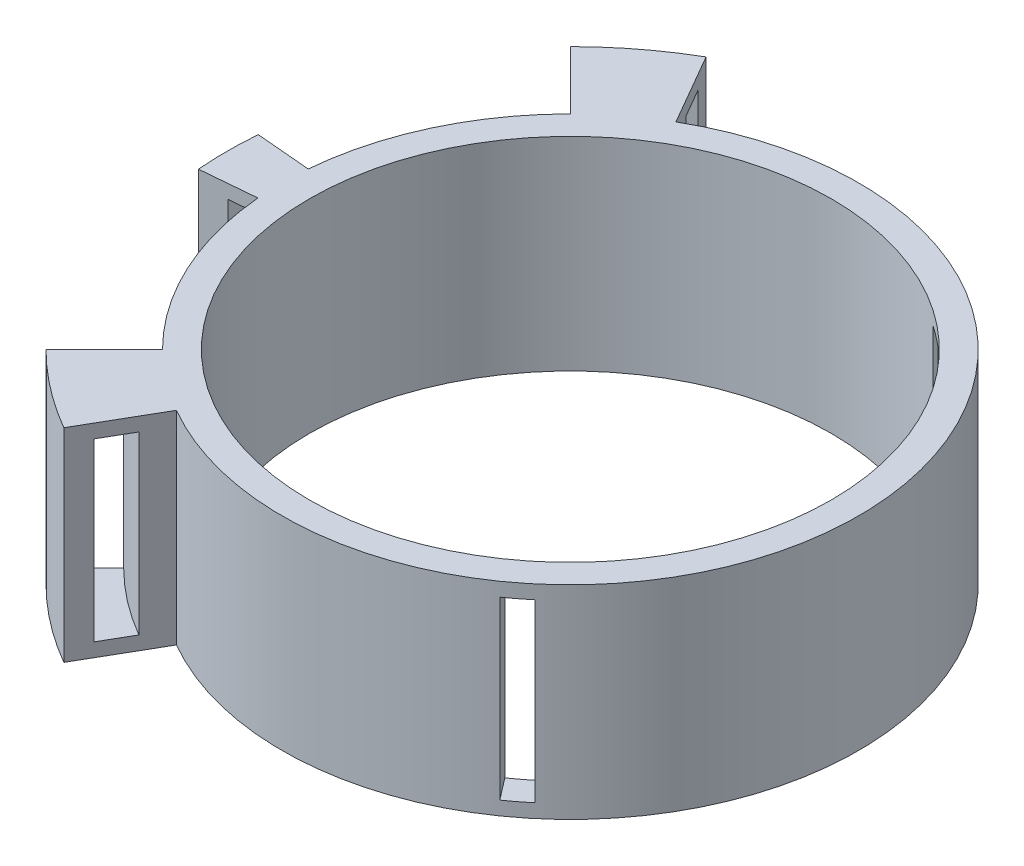
ISO-10303-21;
HEADER;
FILE_DESCRIPTION(('STEP AP214'),'2;1');
FILE_NAME('part.step','',(''),(''),'','','');
FILE_SCHEMA(('AUTOMOTIVE_DESIGN { 1 0 10303 214 1 1 1 1 }'));
ENDSEC;
DATA;
#1=APPLICATION_CONTEXT('core data for automotive mechanical design processes');
#2=APPLICATION_PROTOCOL_DEFINITION('international standard','automotive_design',2000,#1);
#3=PRODUCT_CONTEXT('',#1,'mechanical');
#4=PRODUCT('Part','Part','',(#3));
#5=PRODUCT_RELATED_PRODUCT_CATEGORY('part','',(#4));
#6=PRODUCT_DEFINITION_FORMATION('','',#4);
#7=PRODUCT_DEFINITION_CONTEXT('part definition',#1,'design');
#8=PRODUCT_DEFINITION('design','',#6,#7);
#9=PRODUCT_DEFINITION_SHAPE('','',#8);
#10=(LENGTH_UNIT() NAMED_UNIT(*) SI_UNIT(.MILLI.,.METRE.));
#11=(NAMED_UNIT(*) PLANE_ANGLE_UNIT() SI_UNIT($,.RADIAN.));
#12=(NAMED_UNIT(*) SI_UNIT($,.STERADIAN.) SOLID_ANGLE_UNIT());
#13=UNCERTAINTY_MEASURE_WITH_UNIT(LENGTH_MEASURE(1.E-05),#10,'distance_accuracy_value','');
#14=(GEOMETRIC_REPRESENTATION_CONTEXT(3) GLOBAL_UNCERTAINTY_ASSIGNED_CONTEXT((#13)) GLOBAL_UNIT_ASSIGNED_CONTEXT((#10,
#11,#12)) REPRESENTATION_CONTEXT('',''));
#15=CARTESIAN_POINT('',(0.,0.,0.));
#16=DIRECTION('',(0.,0.,1.));
#17=DIRECTION('',(1.,0.,0.));
#18=AXIS2_PLACEMENT_3D('',#15,#16,#17);
#19=CARTESIAN_POINT('',(0.,0.5,0.));
#20=DIRECTION('',(0.,-1.,0.));
#21=DIRECTION('',(0.,0.,-1.));
#22=AXIS2_PLACEMENT_3D('',#19,#20,#21);
#23=CYLINDRICAL_SURFACE('',#22,10.5);
#24=CARTESIAN_POINT('',(0.,7.4,0.));
#25=DIRECTION('',(0.,1.,0.));
#26=DIRECTION('',(0.,0.,1.));
#27=AXIS2_PLACEMENT_3D('',#24,#25,#26);
#28=CIRCLE('',#27,10.5);
#29=CARTESIAN_POINT('',(-7.42462120245867,7.4,-7.42462120245882));
#30=VERTEX_POINT('',#29);
#31=CARTESIAN_POINT('',(-10.4600443299633,7.4,-0.915135298850366));
#32=VERTEX_POINT('',#31);
#33=EDGE_CURVE('E599',#30,#32,#28,.T.);
#34=ORIENTED_EDGE('',*,*,#33,.F.);
#35=DIRECTION('',(0.,-1.,0.));
#36=VECTOR('',#35,1.);
#37=CARTESIAN_POINT('',(-7.42462120245875,0.5,-7.42462120245875));
#38=LINE('',#37,#36);
#39=CARTESIAN_POINT('',(-7.42462120245875,0.,-7.42462120245875));
#40=VERTEX_POINT('',#39);
#41=EDGE_CURVE('E56',#30,#40,#38,.T.);
#42=ORIENTED_EDGE('',*,*,#41,.T.);
#43=CARTESIAN_POINT('',(0.,0.,0.));
#44=DIRECTION('',(0.,1.,0.));
#45=DIRECTION('',(0.,0.,1.));
#46=AXIS2_PLACEMENT_3D('',#43,#44,#45);
#47=CIRCLE('',#46,10.5);
#48=CARTESIAN_POINT('',(-10.4600443299633,0.,-0.915135298850365));
#49=VERTEX_POINT('',#48);
#50=EDGE_CURVE('E488',#40,#49,#47,.T.);
#51=ORIENTED_EDGE('',*,*,#50,.T.);
#52=DIRECTION('',(0.,-1.,0.));
#53=VECTOR('',#52,1.);
#54=CARTESIAN_POINT('',(-10.4600443299633,0.5,-0.915135298850365));
#55=LINE('',#54,#53);
#56=CARTESIAN_POINT('',(-10.4600443299633,0.5,-0.915135298850365));
#57=VERTEX_POINT('',#56);
#58=EDGE_CURVE('E467',#57,#49,#55,.T.);
#59=ORIENTED_EDGE('',*,*,#58,.F.);
#60=CARTESIAN_POINT('',(0.,0.5,0.));
#61=DIRECTION('',(0.,1.,0.));
#62=DIRECTION('',(0.,0.,1.));
#63=AXIS2_PLACEMENT_3D('',#60,#61,#62);
#64=CIRCLE('',#63,10.5);
#65=CARTESIAN_POINT('',(-10.4600443299633,0.5,0.915135298850311));
#66=VERTEX_POINT('',#65);
#67=EDGE_CURVE('E570',#57,#66,#64,.T.);
#68=ORIENTED_EDGE('',*,*,#67,.T.);
#69=DIRECTION('',(0.,-1.,0.));
#70=VECTOR('',#69,1.);
#71=CARTESIAN_POINT('',(-10.4600443299633,0.5,0.915135298850311));
#72=LINE('',#71,#70);
#73=CARTESIAN_POINT('',(-10.4600443299633,0.,0.915135298850311));
#74=VERTEX_POINT('',#73);
#75=EDGE_CURVE('E473',#66,#74,#72,.T.);
#76=ORIENTED_EDGE('',*,*,#75,.T.);
#77=CARTESIAN_POINT('',(0.,0.,0.));
#78=DIRECTION('',(0.,1.,0.));
#79=DIRECTION('',(0.,0.,1.));
#80=AXIS2_PLACEMENT_3D('',#77,#78,#79);
#81=CIRCLE('',#80,10.5);
#82=CARTESIAN_POINT('',(-7.42462120245875,0.,7.42462120245875));
#83=VERTEX_POINT('',#82);
#84=EDGE_CURVE('E497',#74,#83,#81,.T.);
#85=ORIENTED_EDGE('',*,*,#84,.T.);
#86=DIRECTION('',(0.,-1.,0.));
#87=VECTOR('',#86,1.);
#88=CARTESIAN_POINT('',(-7.42462120245875,0.5,7.42462120245875));
#89=LINE('',#88,#87);
#90=CARTESIAN_POINT('',(-7.42462120245875,7.4,7.42462120245875));
#91=VERTEX_POINT('',#90);
#92=EDGE_CURVE('E505',#91,#83,#89,.T.);
#93=ORIENTED_EDGE('',*,*,#92,.F.);
#94=CARTESIAN_POINT('',(-10.4600443299633,7.4,0.915135298850298));
#95=VERTEX_POINT('',#94);
#96=EDGE_CURVE('E587',#95,#91,#28,.T.);
#97=ORIENTED_EDGE('',*,*,#96,.F.);
#98=DIRECTION('',(0.,-1.,0.));
#99=VECTOR('',#98,1.);
#100=CARTESIAN_POINT('',(-10.4600443299633,7.4,0.915135298850298));
#101=LINE('',#100,#99);
#102=CARTESIAN_POINT('',(-10.4600443299633,6.9,0.915135298850298));
#103=VERTEX_POINT('',#102);
#104=EDGE_CURVE('E323',#95,#103,#101,.T.);
#105=ORIENTED_EDGE('',*,*,#104,.T.);
#106=CARTESIAN_POINT('',(4.64656494415371E-13,6.9,0.));
#107=DIRECTION('',(0.,-1.,0.));
#108=DIRECTION('',(0.,0.,1.));
#109=AXIS2_PLACEMENT_3D('',#106,#107,#108);
#110=CIRCLE('',#109,10.5000000000005);
#111=CARTESIAN_POINT('',(-10.4600443299633,6.9,-0.915135298850366));
#112=VERTEX_POINT('',#111);
#113=EDGE_CURVE('E316',#103,#112,#110,.T.);
#114=ORIENTED_EDGE('',*,*,#113,.T.);
#115=DIRECTION('',(0.,-1.,0.));
#116=VECTOR('',#115,1.);
#117=CARTESIAN_POINT('',(-10.4600443299633,7.4,-0.915135298850366));
#118=LINE('',#117,#116);
#119=EDGE_CURVE('E321',#32,#112,#118,.T.);
#120=ORIENTED_EDGE('',*,*,#119,.F.);
#121=EDGE_LOOP('',(#34,#42,#51,#59,#68,#76,#85,#93,#97,#105,#114,#120));
#122=FACE_BOUND('',#121,.T.);
#123=ADVANCED_FACE('F37',(#122),#23,.T.);
#124=CARTESIAN_POINT('',(0.,6.9,0.));
#125=DIRECTION('',(0.,1.,0.));
#126=DIRECTION('',(0.,0.,1.));
#127=AXIS2_PLACEMENT_3D('',#124,#125,#126);
#128=CIRCLE('',#127,10.5);
#129=CARTESIAN_POINT('',(6.70920905738255,6.9,-8.0769123942467));
#130=VERTEX_POINT('',#129);
#131=CARTESIAN_POINT('',(5.98381017080679,6.9,-8.62809456599481));
#132=VERTEX_POINT('',#131);
#133=EDGE_CURVE('E593',#130,#132,#128,.T.);
#134=ORIENTED_EDGE('',*,*,#133,.T.);
#135=DIRECTION('',(0.,-1.,0.));
#136=VECTOR('',#135,1.);
#137=CARTESIAN_POINT('',(5.98381017080679,6.9,-8.62809456599481));
#138=LINE('',#137,#136);
#139=CARTESIAN_POINT('',(5.98381017080679,0.5,-8.62809456599481));
#140=VERTEX_POINT('',#139);
#141=EDGE_CURVE('E559',#132,#140,#138,.T.);
#142=ORIENTED_EDGE('',*,*,#141,.T.);
#143=CARTESIAN_POINT('',(0.,0.5,0.));
#144=DIRECTION('',(0.,1.,0.));
#145=DIRECTION('',(0.,0.,1.));
#146=AXIS2_PLACEMENT_3D('',#143,#144,#145);
#147=CIRCLE('',#146,10.5);
#148=CARTESIAN_POINT('',(6.70920905738255,0.5,-8.0769123942467));
#149=VERTEX_POINT('',#148);
#150=EDGE_CURVE('E532',#149,#140,#147,.T.);
#151=ORIENTED_EDGE('',*,*,#150,.F.);
#152=DIRECTION('',(0.,-1.,0.));
#153=VECTOR('',#152,1.);
#154=CARTESIAN_POINT('',(6.70920905738255,6.9,-8.0769123942467));
#155=LINE('',#154,#153);
#156=EDGE_CURVE('E573',#130,#149,#155,.T.);
#157=ORIENTED_EDGE('',*,*,#156,.F.);
#158=EDGE_LOOP('',(#134,#142,#151,#157));
#159=FACE_BOUND('',#158,.T.);
#160=DIRECTION('',(0.,-1.,0.));
#161=VECTOR('',#160,1.);
#162=CARTESIAN_POINT('',(6.02746555630799,6.9,8.59765427122543));
#163=LINE('',#162,#161);
#164=CARTESIAN_POINT('',(6.02746555630799,6.9,8.59765427122543));
#165=VERTEX_POINT('',#164);
#166=CARTESIAN_POINT('',(6.02746555630799,0.5,8.59765427122543));
#167=VERTEX_POINT('',#166);
#168=EDGE_CURVE('E548',#165,#167,#163,.T.);
#169=ORIENTED_EDGE('',*,*,#168,.F.);
#170=CARTESIAN_POINT('',(6.74926990170864,6.9,8.04346665274928));
#171=VERTEX_POINT('',#170);
#172=EDGE_CURVE('E590',#165,#171,#128,.T.);
#173=ORIENTED_EDGE('',*,*,#172,.T.);
#174=DIRECTION('',(0.,-1.,0.));
#175=VECTOR('',#174,1.);
#176=CARTESIAN_POINT('',(6.74926990170864,6.9,8.04346665274928));
#177=LINE('',#176,#175);
#178=CARTESIAN_POINT('',(6.74926990170864,0.5,8.04346665274928));
#179=VERTEX_POINT('',#178);
#180=EDGE_CURVE('E522',#171,#179,#177,.T.);
#181=ORIENTED_EDGE('',*,*,#180,.T.);
#182=CARTESIAN_POINT('',(0.,0.5,0.));
#183=DIRECTION('',(0.,1.,0.));
#184=DIRECTION('',(0.,0.,1.));
#185=AXIS2_PLACEMENT_3D('',#182,#183,#184);
#186=CIRCLE('',#185,10.5);
#187=EDGE_CURVE('E537',#167,#179,#186,.T.);
#188=ORIENTED_EDGE('',*,*,#187,.F.);
#189=EDGE_LOOP('',(#169,#173,#181,#188));
#190=FACE_BOUND('',#189,.T.);
#191=DIRECTION('',(0.,-1.,0.));
#192=VECTOR('',#191,1.);
#193=CARTESIAN_POINT('',(-5.25,0.5,-9.09326673973661));
#194=LINE('',#193,#192);
#195=CARTESIAN_POINT('',(-5.25000000000001,7.4,-9.0932667397366));
#196=VERTEX_POINT('',#195);
#197=CARTESIAN_POINT('',(-5.25,0.,-9.09326673973661));
#198=VERTEX_POINT('',#197);
#199=EDGE_CURVE('E64',#196,#198,#194,.T.);
#200=ORIENTED_EDGE('',*,*,#199,.F.);
#201=CARTESIAN_POINT('',(-5.25,7.4,9.0932667397366));
#202=VERTEX_POINT('',#201);
#203=EDGE_CURVE('E459',#202,#196,#28,.T.);
#204=ORIENTED_EDGE('',*,*,#203,.F.);
#205=DIRECTION('',(0.,-1.,0.));
#206=VECTOR('',#205,1.);
#207=CARTESIAN_POINT('',(-5.25,0.5,9.09326673973661));
#208=LINE('',#207,#206);
#209=CARTESIAN_POINT('',(-5.25,0.,9.09326673973661));
#210=VERTEX_POINT('',#209);
#211=EDGE_CURVE('E48',#202,#210,#208,.T.);
#212=ORIENTED_EDGE('',*,*,#211,.T.);
#213=CARTESIAN_POINT('',(0.,0.,0.));
#214=DIRECTION('',(0.,1.,0.));
#215=DIRECTION('',(0.,0.,1.));
#216=AXIS2_PLACEMENT_3D('',#213,#214,#215);
#217=CIRCLE('',#216,10.5);
#218=EDGE_CURVE('E458',#210,#198,#217,.T.);
#219=ORIENTED_EDGE('',*,*,#218,.T.);
#220=EDGE_LOOP('',(#200,#204,#212,#219));
#221=FACE_BOUND('',#220,.T.);
#222=ADVANCED_FACE('F412',(#159,#190,#221),#23,.T.);
#223=CARTESIAN_POINT('',(0.,0.5,0.));
#224=DIRECTION('',(0.,1.,0.));
#225=DIRECTION('',(0.,0.,1.));
#226=AXIS2_PLACEMENT_3D('',#223,#224,#225);
#227=PLANE('',#226);
#228=DIRECTION('',(0.707106781186547,0.,0.707106781186547));
#229=VECTOR('',#228,1.);
#230=CARTESIAN_POINT('',(-7.42462120245875,0.5,-7.42462120245875));
#231=LINE('',#230,#229);
#232=CARTESIAN_POINT('',(-8.98025612106915,0.5,-8.98025612106916));
#233=VERTEX_POINT('',#232);
#234=CARTESIAN_POINT('',(-8.13172798364529,0.5,-8.13172798364529));
#235=VERTEX_POINT('',#234);
#236=EDGE_CURVE('E528',#233,#235,#231,.T.);
#237=ORIENTED_EDGE('',*,*,#236,.T.);
#238=CARTESIAN_POINT('',(5.79397640976254E-13,0.5,6.50521303491303E-13));
#239=DIRECTION('',(0.,1.,0.));
#240=DIRECTION('',(0.,0.,-1.));
#241=AXIS2_PLACEMENT_3D('',#238,#239,#240);
#242=CIRCLE('',#241,11.5000000000009);
#243=CARTESIAN_POINT('',(-5.75,0.5,-9.95929214352105));
#244=VERTEX_POINT('',#243);
#245=EDGE_CURVE('E656',#244,#235,#242,.T.);
#246=ORIENTED_EDGE('',*,*,#245,.F.);
#247=DIRECTION('',(-0.5,0.,-0.866025403784439));
#248=VECTOR('',#247,1.);
#249=CARTESIAN_POINT('',(-5.25,0.5,-9.09326673973661));
#250=LINE('',#249,#248);
#251=CARTESIAN_POINT('',(-6.35,0.5,-10.9985226280624));
#252=VERTEX_POINT('',#251);
#253=EDGE_CURVE('E530',#244,#252,#250,.T.);
#254=ORIENTED_EDGE('',*,*,#253,.T.);
#255=CARTESIAN_POINT('',(-1.28369537222284E-13,0.5,-1.94289029309402E-13));
#256=DIRECTION('',(0.,-1.,0.));
#257=DIRECTION('',(0.,0.,-1.));
#258=AXIS2_PLACEMENT_3D('',#255,#256,#257);
#259=CIRCLE('',#258,12.6999999999998);
#260=EDGE_CURVE('E644',#233,#252,#259,.T.);
#261=ORIENTED_EDGE('',*,*,#260,.F.);
#262=EDGE_LOOP('',(#237,#246,#254,#261));
#263=FACE_BOUND('',#262,.T.);
#264=ADVANCED_FACE('F400',(#263),#227,.T.);
#265=DIRECTION('',(-0.996194698091746,0.,-0.0871557427476535));
#266=VECTOR('',#265,1.);
#267=CARTESIAN_POINT('',(-10.4600443299633,0.5,-0.915135298850362));
#268=LINE('',#267,#266);
#269=CARTESIAN_POINT('',(-11.4562390280551,0.5,-1.00229104159802));
#270=VERTEX_POINT('',#269);
#271=EDGE_CURVE('E526',#57,#270,#268,.T.);
#272=ORIENTED_EDGE('',*,*,#271,.T.);
#273=CARTESIAN_POINT('',(2.61943244872498E-13,0.5,0.));
#274=DIRECTION('',(0.,-1.,0.));
#275=DIRECTION('',(0.,0.,1.));
#276=AXIS2_PLACEMENT_3D('',#273,#274,#275);
#277=CIRCLE('',#276,11.5000000000003);
#278=CARTESIAN_POINT('',(-11.4562390280551,0.5,1.00229104159796));
#279=VERTEX_POINT('',#278);
#280=EDGE_CURVE('E632',#279,#270,#277,.T.);
#281=ORIENTED_EDGE('',*,*,#280,.F.);
#282=DIRECTION('',(0.996194698091746,0.,-0.0871557427476487));
#283=VECTOR('',#282,1.);
#284=CARTESIAN_POINT('',(-10.4600443299633,0.5,0.915135298850311));
#285=LINE('',#284,#283);
#286=EDGE_CURVE('E524',#279,#66,#285,.T.);
#287=ORIENTED_EDGE('',*,*,#286,.T.);
#288=ORIENTED_EDGE('',*,*,#67,.F.);
#289=EDGE_LOOP('',(#272,#281,#287,#288));
#290=FACE_BOUND('',#289,.T.);
#291=ADVANCED_FACE('F398',(#290),#227,.T.);
#292=DIRECTION('',(0.5,0.,-0.866025403784439));
#293=VECTOR('',#292,1.);
#294=CARTESIAN_POINT('',(-5.25,0.5,9.09326673973661));
#295=LINE('',#294,#293);
#296=CARTESIAN_POINT('',(-6.35000000000001,0.5,10.9985226280624));
#297=VERTEX_POINT('',#296);
#298=CARTESIAN_POINT('',(-5.75,0.5,9.95929214352105));
#299=VERTEX_POINT('',#298);
#300=EDGE_CURVE('E501',#297,#299,#295,.T.);
#301=ORIENTED_EDGE('',*,*,#300,.T.);
#302=CARTESIAN_POINT('',(0.,0.5,0.));
#303=DIRECTION('',(0.,1.,0.));
#304=DIRECTION('',(0.,0.,1.));
#305=AXIS2_PLACEMENT_3D('',#302,#303,#304);
#306=CIRCLE('',#305,11.5000000000001);
#307=CARTESIAN_POINT('',(-8.13172798364529,0.5,8.13172798364529));
#308=VERTEX_POINT('',#307);
#309=EDGE_CURVE('E620',#308,#299,#306,.T.);
#310=ORIENTED_EDGE('',*,*,#309,.F.);
#311=DIRECTION('',(-0.707106781186548,0.,0.707106781186548));
#312=VECTOR('',#311,1.);
#313=CARTESIAN_POINT('',(-7.42462120245875,0.5,7.42462120245875));
#314=LINE('',#313,#312);
#315=CARTESIAN_POINT('',(-8.98025612106915,0.5,8.98025612106915));
#316=VERTEX_POINT('',#315);
#317=EDGE_CURVE('E506',#308,#316,#314,.T.);
#318=ORIENTED_EDGE('',*,*,#317,.T.);
#319=CARTESIAN_POINT('',(2.23779328401008E-13,0.5,-2.53269627492614E-13));
#320=DIRECTION('',(0.,-1.,0.));
#321=DIRECTION('',(0.,0.,1.));
#322=AXIS2_PLACEMENT_3D('',#319,#320,#321);
#323=CIRCLE('',#322,12.7000000000003);
#324=EDGE_CURVE('E608',#297,#316,#323,.T.);
#325=ORIENTED_EDGE('',*,*,#324,.F.);
#326=EDGE_LOOP('',(#301,#310,#318,#325));
#327=FACE_BOUND('',#326,.T.);
#328=ADVANCED_FACE('F394',(#327),#227,.T.);
#329=CARTESIAN_POINT('',(0.,0.5,0.));
#330=DIRECTION('',(0.,-1.,0.));
#331=DIRECTION('',(0.,0.,1.));
#332=AXIS2_PLACEMENT_3D('',#329,#330,#331);
#333=CIRCLE('',#332,9.5);
#334=CARTESIAN_POINT('',(5.37818083124572,0.5,-7.83103894425389));
#335=VERTEX_POINT('',#334);
#336=CARTESIAN_POINT('',(6.07023676620326,0.5,-7.30768264241368));
#337=VERTEX_POINT('',#336);
#338=EDGE_CURVE('E536',#335,#337,#333,.T.);
#339=ORIENTED_EDGE('',*,*,#338,.T.);
#340=DIRECTION('',(-0.638972291179291,0.,0.769229751833019));
#341=VECTOR('',#340,1.);
#342=CARTESIAN_POINT('',(0.,0.5,0.));
#343=LINE('',#342,#341);
#344=EDGE_CURVE('E584',#149,#337,#343,.T.);
#345=ORIENTED_EDGE('',*,*,#344,.F.);
#346=ORIENTED_EDGE('',*,*,#150,.T.);
#347=DIRECTION('',(0.604999089059933,0.,-0.796226162743131));
#348=VECTOR('',#347,1.);
#349=CARTESIAN_POINT('',(-0.362699443287879,0.5,-0.275591085874055));
#350=LINE('',#349,#348);
#351=EDGE_CURVE('E563',#335,#140,#350,.T.);
#352=ORIENTED_EDGE('',*,*,#351,.F.);
#353=EDGE_LOOP('',(#339,#345,#346,#352));
#354=FACE_BOUND('',#353,.T.);
#355=ADVANCED_FACE('F397',(#354),#227,.T.);
#356=CARTESIAN_POINT('',(6.10648229202211,0.5,7.2774222096303));
#357=VERTEX_POINT('',#356);
#358=CARTESIAN_POINT('',(5.41784455697416,0.5,7.80365045068431));
#359=VERTEX_POINT('',#358);
#360=EDGE_CURVE('E534',#357,#359,#333,.T.);
#361=ORIENTED_EDGE('',*,*,#360,.T.);
#362=DIRECTION('',(-0.608988032530658,0.,-0.793179409865409));
#363=VECTOR('',#362,1.);
#364=CARTESIAN_POINT('',(-0.360902172700351,0.5,0.27709380923809));
#365=LINE('',#364,#363);
#366=EDGE_CURVE('E567',#167,#359,#365,.T.);
#367=ORIENTED_EDGE('',*,*,#366,.F.);
#368=ORIENTED_EDGE('',*,*,#187,.T.);
#369=DIRECTION('',(-0.642787609686538,0.,-0.766044443118979));
#370=VECTOR('',#369,1.);
#371=CARTESIAN_POINT('',(0.,0.5,0.));
#372=LINE('',#371,#370);
#373=EDGE_CURVE('E545',#179,#357,#372,.T.);
#374=ORIENTED_EDGE('',*,*,#373,.T.);
#375=EDGE_LOOP('',(#361,#367,#368,#374));
#376=FACE_BOUND('',#375,.T.);
#377=ADVANCED_FACE('F401',(#376),#227,.T.);
#378=CARTESIAN_POINT('',(0.,0.5,0.));
#379=DIRECTION('',(0.,-1.,0.));
#380=DIRECTION('',(0.,0.,-1.));
#381=AXIS2_PLACEMENT_3D('',#378,#379,#380);
#382=CYLINDRICAL_SURFACE('',#381,13.5);
#383=CARTESIAN_POINT('',(0.,0.,0.));
#384=DIRECTION('',(0.,1.,0.));
#385=DIRECTION('',(0.,0.,1.));
#386=AXIS2_PLACEMENT_3D('',#383,#384,#385);
#387=CIRCLE('',#386,13.5);
#388=CARTESIAN_POINT('',(-9.54594154601839,0.,9.54594154601839));
#389=VERTEX_POINT('',#388);
#390=CARTESIAN_POINT('',(-6.75,0.,11.6913429510899));
#391=VERTEX_POINT('',#390);
#392=EDGE_CURVE('E456',#389,#391,#387,.T.);
#393=ORIENTED_EDGE('',*,*,#392,.T.);
#394=DIRECTION('',(0.,-1.,0.));
#395=VECTOR('',#394,1.);
#396=CARTESIAN_POINT('',(-6.75,0.5,11.6913429510899));
#397=LINE('',#396,#395);
#398=CARTESIAN_POINT('',(-6.75,7.4,11.6913429510899));
#399=VERTEX_POINT('',#398);
#400=EDGE_CURVE('E11',#399,#391,#397,.T.);
#401=ORIENTED_EDGE('',*,*,#400,.F.);
#402=CARTESIAN_POINT('',(-2.32452945780892E-13,7.4,-4.16333634234434E-13));
#403=DIRECTION('',(0.,1.,0.));
#404=DIRECTION('',(0.,0.,1.));
#405=AXIS2_PLACEMENT_3D('',#402,#403,#404);
#406=CIRCLE('',#405,13.5000000000002);
#407=CARTESIAN_POINT('',(-9.54594154601839,7.4,9.54594154601839));
#408=VERTEX_POINT('',#407);
#409=EDGE_CURVE('E289',#408,#399,#406,.T.);
#410=ORIENTED_EDGE('',*,*,#409,.F.);
#411=DIRECTION('',(0.,-1.,0.));
#412=VECTOR('',#411,1.);
#413=CARTESIAN_POINT('',(-9.54594154601839,0.5,9.54594154601839));
#414=LINE('',#413,#412);
#415=EDGE_CURVE('E502',#408,#389,#414,.T.);
#416=ORIENTED_EDGE('',*,*,#415,.T.);
#417=EDGE_LOOP('',(#393,#401,#410,#416));
#418=FACE_BOUND('',#417,.T.);
#419=ADVANCED_FACE('F39',(#418),#382,.T.);
#420=CARTESIAN_POINT('',(-5.25,0.5,9.09326673973661));
#421=DIRECTION('',(-0.866025403784439,0.,-0.5));
#422=DIRECTION('',(-0.5,0.,0.866025403784439));
#423=AXIS2_PLACEMENT_3D('',#420,#421,#422);
#424=PLANE('',#423);
#425=DIRECTION('',(0.,-1.,0.));
#426=VECTOR('',#425,1.);
#427=CARTESIAN_POINT('',(-6.35000000000001,6.9,10.9985226280624));
#428=LINE('',#427,#426);
#429=CARTESIAN_POINT('',(-6.35000000000001,6.9,10.9985226280624));
#430=VERTEX_POINT('',#429);
#431=EDGE_CURVE('E447',#430,#297,#428,.T.);
#432=ORIENTED_EDGE('',*,*,#431,.F.);
#433=DIRECTION('',(0.5,0.,-0.866025403784439));
#434=VECTOR('',#433,1.);
#435=CARTESIAN_POINT('',(-6.75,6.9,11.6913429510899));
#436=LINE('',#435,#434);
#437=CARTESIAN_POINT('',(-5.75,6.9,9.95929214352105));
#438=VERTEX_POINT('',#437);
#439=EDGE_CURVE('E286',#430,#438,#436,.T.);
#440=ORIENTED_EDGE('',*,*,#439,.T.);
#441=DIRECTION('',(0.,-1.,0.));
#442=VECTOR('',#441,1.);
#443=CARTESIAN_POINT('',(-5.75,6.9,9.95929214352105));
#444=LINE('',#443,#442);
#445=EDGE_CURVE('E616',#438,#299,#444,.T.);
#446=ORIENTED_EDGE('',*,*,#445,.T.);
#447=ORIENTED_EDGE('',*,*,#300,.F.);
#448=EDGE_LOOP('',(#432,#440,#446,#447));
#449=FACE_BOUND('',#448,.T.);
#450=DIRECTION('',(0.5,0.,-0.866025403784439));
#451=VECTOR('',#450,1.);
#452=CARTESIAN_POINT('',(-5.25,0.,9.09326673973661));
#453=LINE('',#452,#451);
#454=EDGE_CURVE('E450',#391,#210,#453,.T.);
#455=ORIENTED_EDGE('',*,*,#454,.T.);
#456=ORIENTED_EDGE('',*,*,#211,.F.);
#457=DIRECTION('',(0.5,0.,-0.866025403784439));
#458=VECTOR('',#457,1.);
#459=CARTESIAN_POINT('',(-6.75,7.4,11.6913429510899));
#460=LINE('',#459,#458);
#461=EDGE_CURVE('E292',#399,#202,#460,.T.);
#462=ORIENTED_EDGE('',*,*,#461,.F.);
#463=ORIENTED_EDGE('',*,*,#400,.T.);
#464=EDGE_LOOP('',(#455,#456,#462,#463));
#465=FACE_BOUND('',#464,.T.);
#466=ADVANCED_FACE('F436',(#449,#465),#424,.F.);
#467=CARTESIAN_POINT('',(0.,0.5,0.));
#468=DIRECTION('',(0.,-1.,0.));
#469=DIRECTION('',(0.,0.,-1.));
#470=AXIS2_PLACEMENT_3D('',#467,#468,#469);
#471=CYLINDRICAL_SURFACE('',#470,9.5);
#472=CARTESIAN_POINT('',(0.,0.,0.));
#473=DIRECTION('',(0.,-1.,0.));
#474=DIRECTION('',(0.,0.,1.));
#475=AXIS2_PLACEMENT_3D('',#472,#473,#474);
#476=CIRCLE('',#475,9.5);
#477=CARTESIAN_POINT('',(0.,0.,9.5));
#478=VERTEX_POINT('',#477);
#479=EDGE_CURVE('E455',#478,#478,#476,.T.);
#480=ORIENTED_EDGE('',*,*,#479,.T.);
#481=EDGE_LOOP('',(#480));
#482=FACE_BOUND('',#481,.T.);
#483=DIRECTION('',(0.,-1.,0.));
#484=VECTOR('',#483,1.);
#485=CARTESIAN_POINT('',(6.10648229202211,6.9,7.2774222096303));
#486=LINE('',#485,#484);
#487=CARTESIAN_POINT('',(6.10648229202211,6.9,7.2774222096303));
#488=VERTEX_POINT('',#487);
#489=EDGE_CURVE('E542',#488,#357,#486,.T.);
#490=ORIENTED_EDGE('',*,*,#489,.F.);
#491=CARTESIAN_POINT('',(0.,6.9,0.));
#492=DIRECTION('',(0.,-1.,0.));
#493=DIRECTION('',(0.,0.,1.));
#494=AXIS2_PLACEMENT_3D('',#491,#492,#493);
#495=CIRCLE('',#494,9.5);
#496=CARTESIAN_POINT('',(5.41784455697416,6.9,7.80365045068431));
#497=VERTEX_POINT('',#496);
#498=EDGE_CURVE('E594',#488,#497,#495,.T.);
#499=ORIENTED_EDGE('',*,*,#498,.T.);
#500=DIRECTION('',(0.,-1.,0.));
#501=VECTOR('',#500,1.);
#502=CARTESIAN_POINT('',(5.41784455697416,6.9,7.80365045068431));
#503=LINE('',#502,#501);
#504=EDGE_CURVE('E553',#497,#359,#503,.T.);
#505=ORIENTED_EDGE('',*,*,#504,.T.);
#506=ORIENTED_EDGE('',*,*,#360,.F.);
#507=EDGE_LOOP('',(#490,#499,#505,#506));
#508=FACE_BOUND('',#507,.T.);
#509=DIRECTION('',(0.,-1.,0.));
#510=VECTOR('',#509,1.);
#511=CARTESIAN_POINT('',(5.37818083124572,6.9,-7.83103894425389));
#512=LINE('',#511,#510);
#513=CARTESIAN_POINT('',(5.37818083124572,6.9,-7.83103894425389));
#514=VERTEX_POINT('',#513);
#515=EDGE_CURVE('E556',#514,#335,#512,.T.);
#516=ORIENTED_EDGE('',*,*,#515,.F.);
#517=CARTESIAN_POINT('',(6.07023676620326,6.9,-7.30768264241368));
#518=VERTEX_POINT('',#517);
#519=EDGE_CURVE('E595',#514,#518,#495,.T.);
#520=ORIENTED_EDGE('',*,*,#519,.T.);
#521=DIRECTION('',(0.,-1.,0.));
#522=VECTOR('',#521,1.);
#523=CARTESIAN_POINT('',(6.07023676620326,6.9,-7.30768264241368));
#524=LINE('',#523,#522);
#525=EDGE_CURVE('E580',#518,#337,#524,.T.);
#526=ORIENTED_EDGE('',*,*,#525,.T.);
#527=ORIENTED_EDGE('',*,*,#338,.F.);
#528=EDGE_LOOP('',(#516,#520,#526,#527));
#529=FACE_BOUND('',#528,.T.);
#530=CARTESIAN_POINT('',(0.,7.4,0.));
#531=DIRECTION('',(0.,-1.,0.));
#532=DIRECTION('',(0.,0.,1.));
#533=AXIS2_PLACEMENT_3D('',#530,#531,#532);
#534=CIRCLE('',#533,9.5);
#535=CARTESIAN_POINT('',(0.,7.4,9.5));
#536=VERTEX_POINT('',#535);
#537=EDGE_CURVE('E600',#536,#536,#534,.T.);
#538=ORIENTED_EDGE('',*,*,#537,.F.);
#539=EDGE_LOOP('',(#538));
#540=FACE_BOUND('',#539,.T.);
#541=ADVANCED_FACE('F433',(#482,#508,#529,#540),#471,.F.);
#542=CARTESIAN_POINT('',(-5.25,0.5,-9.09326673973661));
#543=DIRECTION('',(-0.866025403784439,0.,0.5));
#544=DIRECTION('',(0.5,0.,0.866025403784439));
#545=AXIS2_PLACEMENT_3D('',#542,#543,#544);
#546=PLANE('',#545);
#547=DIRECTION('',(0.,-1.,0.));
#548=VECTOR('',#547,1.);
#549=CARTESIAN_POINT('',(-6.75,0.5,-11.6913429510899));
#550=LINE('',#549,#548);
#551=CARTESIAN_POINT('',(-6.75,7.4,-11.6913429510901));
#552=VERTEX_POINT('',#551);
#553=CARTESIAN_POINT('',(-6.75,0.,-11.6913429510899));
#554=VERTEX_POINT('',#553);
#555=EDGE_CURVE('E266',#552,#554,#550,.T.);
#556=ORIENTED_EDGE('',*,*,#555,.F.);
#557=DIRECTION('',(-0.500000000000001,0.,-0.866025403784438));
#558=VECTOR('',#557,1.);
#559=CARTESIAN_POINT('',(-6.75,7.4,-11.6913429510901));
#560=LINE('',#559,#558);
#561=EDGE_CURVE('E272',#196,#552,#560,.T.);
#562=ORIENTED_EDGE('',*,*,#561,.F.);
#563=ORIENTED_EDGE('',*,*,#199,.T.);
#564=DIRECTION('',(-0.5,0.,-0.866025403784439));
#565=VECTOR('',#564,1.);
#566=CARTESIAN_POINT('',(-5.25,0.,-9.09326673973661));
#567=LINE('',#566,#565);
#568=EDGE_CURVE('E514',#198,#554,#567,.T.);
#569=ORIENTED_EDGE('',*,*,#568,.T.);
#570=EDGE_LOOP('',(#556,#562,#563,#569));
#571=FACE_BOUND('',#570,.T.);
#572=DIRECTION('',(-0.500000000000001,0.,-0.866025403784438));
#573=VECTOR('',#572,1.);
#574=CARTESIAN_POINT('',(-6.75,6.9,-11.6913429510901));
#575=LINE('',#574,#573);
#576=CARTESIAN_POINT('',(-5.74999999999995,6.9,-9.9592921435211));
#577=VERTEX_POINT('',#576);
#578=CARTESIAN_POINT('',(-6.35,6.9,-10.9985226280624));
#579=VERTEX_POINT('',#578);
#580=EDGE_CURVE('E279',#577,#579,#575,.T.);
#581=ORIENTED_EDGE('',*,*,#580,.T.);
#582=DIRECTION('',(0.,-1.,0.));
#583=VECTOR('',#582,1.);
#584=CARTESIAN_POINT('',(-6.35,6.9,-10.9985226280624));
#585=LINE('',#584,#583);
#586=EDGE_CURVE('E640',#579,#252,#585,.T.);
#587=ORIENTED_EDGE('',*,*,#586,.T.);
#588=ORIENTED_EDGE('',*,*,#253,.F.);
#589=DIRECTION('',(0.,-1.,0.));
#590=VECTOR('',#589,1.);
#591=CARTESIAN_POINT('',(-5.75000000000001,6.9,-9.95929214352105));
#592=LINE('',#591,#590);
#593=EDGE_CURVE('E647',#577,#244,#592,.T.);
#594=ORIENTED_EDGE('',*,*,#593,.F.);
#595=EDGE_LOOP('',(#581,#587,#588,#594));
#596=FACE_BOUND('',#595,.T.);
#597=ADVANCED_FACE('F430',(#571,#596),#546,.F.);
#598=CARTESIAN_POINT('',(0.,0.5,0.));
#599=DIRECTION('',(0.,-1.,0.));
#600=DIRECTION('',(0.,0.,-1.));
#601=AXIS2_PLACEMENT_3D('',#598,#599,#600);
#602=CYLINDRICAL_SURFACE('',#601,13.5);
#603=CARTESIAN_POINT('',(0.,0.,0.));
#604=DIRECTION('',(0.,1.,0.));
#605=DIRECTION('',(0.,0.,1.));
#606=AXIS2_PLACEMENT_3D('',#603,#604,#605);
#607=CIRCLE('',#606,13.5);
#608=CARTESIAN_POINT('',(-9.54594154601839,0.,-9.5459415460184));
#609=VERTEX_POINT('',#608);
#610=EDGE_CURVE('E264',#554,#609,#607,.T.);
#611=ORIENTED_EDGE('',*,*,#610,.T.);
#612=DIRECTION('',(0.,-1.,0.));
#613=VECTOR('',#612,1.);
#614=CARTESIAN_POINT('',(-9.54594154601839,0.5,-9.5459415460184));
#615=LINE('',#614,#613);
#616=CARTESIAN_POINT('',(-9.54594154601839,7.4,-9.54594154601853));
#617=VERTEX_POINT('',#616);
#618=EDGE_CURVE('E258',#617,#609,#615,.T.);
#619=ORIENTED_EDGE('',*,*,#618,.F.);
#620=CARTESIAN_POINT('',(-1.31838984174237E-13,7.4,-3.48679418671338E-13));
#621=DIRECTION('',(0.,1.,0.));
#622=DIRECTION('',(0.,0.,1.));
#623=AXIS2_PLACEMENT_3D('',#620,#621,#622);
#624=CIRCLE('',#623,13.4999999999998);
#625=EDGE_CURVE('E262',#552,#617,#624,.T.);
#626=ORIENTED_EDGE('',*,*,#625,.F.);
#627=ORIENTED_EDGE('',*,*,#555,.T.);
#628=EDGE_LOOP('',(#611,#619,#626,#627));
#629=FACE_BOUND('',#628,.T.);
#630=ADVANCED_FACE('F259',(#629),#602,.T.);
#631=CARTESIAN_POINT('',(-7.42462120245875,0.5,-7.42462120245875));
#632=DIRECTION('',(0.707106781186547,0.,-0.707106781186547));
#633=DIRECTION('',(-0.707106781186548,0.,-0.707106781186548));
#634=AXIS2_PLACEMENT_3D('',#631,#632,#633);
#635=PLANE('',#634);
#636=DIRECTION('',(0.,-1.,0.));
#637=VECTOR('',#636,1.);
#638=CARTESIAN_POINT('',(-8.98025612106915,6.9,-8.98025612106916));
#639=LINE('',#638,#637);
#640=CARTESIAN_POINT('',(-8.98025612106915,6.9,-8.98025612106916));
#641=VERTEX_POINT('',#640);
#642=EDGE_CURVE('E635',#641,#233,#639,.T.);
#643=ORIENTED_EDGE('',*,*,#642,.F.);
#644=DIRECTION('',(0.707106781186549,0.,0.707106781186546));
#645=VECTOR('',#644,1.);
#646=CARTESIAN_POINT('',(-9.54594154601839,6.9,-9.54594154601853));
#647=LINE('',#646,#645);
#648=CARTESIAN_POINT('',(-8.13172798364529,6.9,-8.1317279836453));
#649=VERTEX_POINT('',#648);
#650=EDGE_CURVE('E282',#641,#649,#647,.T.);
#651=ORIENTED_EDGE('',*,*,#650,.T.);
#652=DIRECTION('',(0.,-1.,0.));
#653=VECTOR('',#652,1.);
#654=CARTESIAN_POINT('',(-8.13172798364529,6.9,-8.1317279836453));
#655=LINE('',#654,#653);
#656=EDGE_CURVE('E652',#649,#235,#655,.T.);
#657=ORIENTED_EDGE('',*,*,#656,.T.);
#658=ORIENTED_EDGE('',*,*,#236,.F.);
#659=EDGE_LOOP('',(#643,#651,#657,#658));
#660=FACE_BOUND('',#659,.T.);
#661=DIRECTION('',(0.707106781186547,0.,0.707106781186547));
#662=VECTOR('',#661,1.);
#663=CARTESIAN_POINT('',(-7.42462120245875,0.,-7.42462120245875));
#664=LINE('',#663,#662);
#665=EDGE_CURVE('E492',#609,#40,#664,.T.);
#666=ORIENTED_EDGE('',*,*,#665,.T.);
#667=ORIENTED_EDGE('',*,*,#41,.F.);
#668=DIRECTION('',(0.707106781186549,0.,0.707106781186546));
#669=VECTOR('',#668,1.);
#670=CARTESIAN_POINT('',(-9.54594154601839,7.4,-9.54594154601853));
#671=LINE('',#670,#669);
#672=EDGE_CURVE('E269',#617,#30,#671,.T.);
#673=ORIENTED_EDGE('',*,*,#672,.F.);
#674=ORIENTED_EDGE('',*,*,#618,.T.);
#675=EDGE_LOOP('',(#666,#667,#673,#674));
#676=FACE_BOUND('',#675,.T.);
#677=ADVANCED_FACE('F270',(#660,#676),#635,.F.);
#678=CARTESIAN_POINT('',(-10.4600443299633,0.5,-0.915135298850362));
#679=DIRECTION('',(-0.0871557427476535,0.,0.996194698091746));
#680=DIRECTION('',(0.996194698091746,0.,0.0871557427476535));
#681=AXIS2_PLACEMENT_3D('',#678,#679,#680);
#682=PLANE('',#681);
#683=DIRECTION('',(-0.996194698091746,0.,-0.0871557427476535));
#684=VECTOR('',#683,1.);
#685=CARTESIAN_POINT('',(-10.4600443299633,0.,-0.915135298850362));
#686=LINE('',#685,#684);
#687=CARTESIAN_POINT('',(-12.4524337261468,0.,-1.08944678434567));
#688=VERTEX_POINT('',#687);
#689=EDGE_CURVE('E483',#49,#688,#686,.T.);
#690=ORIENTED_EDGE('',*,*,#689,.T.);
#691=DIRECTION('',(0.,-1.,0.));
#692=VECTOR('',#691,1.);
#693=CARTESIAN_POINT('',(-12.4524337261468,0.5,-1.08944678434567));
#694=LINE('',#693,#692);
#695=CARTESIAN_POINT('',(-12.4524337261468,6.9,-1.08944678434567));
#696=VERTEX_POINT('',#695);
#697=EDGE_CURVE('E464',#696,#688,#694,.T.);
#698=ORIENTED_EDGE('',*,*,#697,.F.);
#699=DIRECTION('',(0.,-1.,0.));
#700=VECTOR('',#699,1.);
#701=CARTESIAN_POINT('',(-12.4524337261468,7.4,-1.08944678434567));
#702=LINE('',#701,#700);
#703=CARTESIAN_POINT('',(-12.4524337261468,7.4,-1.08944678434567));
#704=VERTEX_POINT('',#703);
#705=EDGE_CURVE('E313',#704,#696,#702,.T.);
#706=ORIENTED_EDGE('',*,*,#705,.F.);
#707=DIRECTION('',(-0.996194698091746,0.,-0.0871557427476516));
#708=VECTOR('',#707,1.);
#709=CARTESIAN_POINT('',(-12.4524337261468,7.4,-1.08944678434567));
#710=LINE('',#709,#708);
#711=EDGE_CURVE('E311',#32,#704,#710,.T.);
#712=ORIENTED_EDGE('',*,*,#711,.F.);
#713=ORIENTED_EDGE('',*,*,#119,.T.);
#714=DIRECTION('',(-0.996194698091746,0.,-0.0871557427476516));
#715=VECTOR('',#714,1.);
#716=CARTESIAN_POINT('',(-12.4524337261468,6.9,-1.08944678434567));
#717=LINE('',#716,#715);
#718=CARTESIAN_POINT('',(-11.4562390280551,6.9,-1.00229104159802));
#719=VERTEX_POINT('',#718);
#720=EDGE_CURVE('E308',#112,#719,#717,.T.);
#721=ORIENTED_EDGE('',*,*,#720,.T.);
#722=DIRECTION('',(0.,-1.,0.));
#723=VECTOR('',#722,1.);
#724=CARTESIAN_POINT('',(-11.4562390280551,6.9,-1.00229104159802));
#725=LINE('',#724,#723);
#726=EDGE_CURVE('E628',#719,#270,#725,.T.);
#727=ORIENTED_EDGE('',*,*,#726,.T.);
#728=ORIENTED_EDGE('',*,*,#271,.F.);
#729=ORIENTED_EDGE('',*,*,#58,.T.);
#730=EDGE_LOOP('',(#690,#698,#706,#712,#713,#721,#727,#728,#729));
#731=FACE_BOUND('',#730,.T.);
#732=ADVANCED_FACE('F420',(#731),#682,.F.);
#733=CARTESIAN_POINT('',(0.,0.5,0.));
#734=DIRECTION('',(0.,-1.,0.));
#735=DIRECTION('',(0.,0.,-1.));
#736=AXIS2_PLACEMENT_3D('',#733,#734,#735);
#737=CYLINDRICAL_SURFACE('',#736,12.5);
#738=CARTESIAN_POINT('',(0.,0.,0.));
#739=DIRECTION('',(0.,1.,0.));
#740=DIRECTION('',(0.,0.,1.));
#741=AXIS2_PLACEMENT_3D('',#738,#739,#740);
#742=CIRCLE('',#741,12.5);
#743=CARTESIAN_POINT('',(-12.4524337261468,0.,1.0894467843456));
#744=VERTEX_POINT('',#743);
#745=EDGE_CURVE('E487',#688,#744,#742,.T.);
#746=ORIENTED_EDGE('',*,*,#745,.T.);
#747=DIRECTION('',(0.,-1.,0.));
#748=VECTOR('',#747,1.);
#749=CARTESIAN_POINT('',(-12.4524337261468,0.5,1.0894467843456));
#750=LINE('',#749,#748);
#751=CARTESIAN_POINT('',(-12.4524337261468,6.9,1.0894467843456));
#752=VERTEX_POINT('',#751);
#753=EDGE_CURVE('E468',#752,#744,#750,.T.);
#754=ORIENTED_EDGE('',*,*,#753,.F.);
#755=CARTESIAN_POINT('',(0.501836060455715,6.9,0.));
#756=DIRECTION('',(0.,1.,0.));
#757=DIRECTION('',(-0.996482291277105,0.,-0.0838035987958192));
#758=AXIS2_PLACEMENT_3D('',#755,#756,#757);
#759=CIRCLE('',#758,13.0000000000002);
#760=EDGE_CURVE('E299',#696,#752,#759,.T.);
#761=ORIENTED_EDGE('',*,*,#760,.F.);
#762=ORIENTED_EDGE('',*,*,#697,.T.);
#763=EDGE_LOOP('',(#746,#754,#761,#762));
#764=FACE_BOUND('',#763,.T.);
#765=ADVANCED_FACE('F415',(#764),#737,.T.);
#766=CARTESIAN_POINT('',(-10.4600443299633,0.5,0.915135298850311));
#767=DIRECTION('',(-0.0871557427476487,0.,-0.996194698091746));
#768=DIRECTION('',(-0.996194698091746,0.,0.0871557427476487));
#769=AXIS2_PLACEMENT_3D('',#766,#767,#768);
#770=PLANE('',#769);
#771=DIRECTION('',(0.996194698091746,0.,-0.0871557427476487));
#772=VECTOR('',#771,1.);
#773=CARTESIAN_POINT('',(-10.4600443299633,0.,0.915135298850311));
#774=LINE('',#773,#772);
#775=EDGE_CURVE('E490',#744,#74,#774,.T.);
#776=ORIENTED_EDGE('',*,*,#775,.T.);
#777=ORIENTED_EDGE('',*,*,#75,.F.);
#778=ORIENTED_EDGE('',*,*,#286,.F.);
#779=DIRECTION('',(0.,-1.,0.));
#780=VECTOR('',#779,1.);
#781=CARTESIAN_POINT('',(-11.4562390280551,6.9,1.00229104159796));
#782=LINE('',#781,#780);
#783=CARTESIAN_POINT('',(-11.4562390280551,6.9,1.00229104159796));
#784=VERTEX_POINT('',#783);
#785=EDGE_CURVE('E623',#784,#279,#782,.T.);
#786=ORIENTED_EDGE('',*,*,#785,.F.);
#787=DIRECTION('',(0.996194698091746,0.,-0.0871557427476495));
#788=VECTOR('',#787,1.);
#789=CARTESIAN_POINT('',(-12.4524337261468,6.9,1.0894467843456));
#790=LINE('',#789,#788);
#791=EDGE_CURVE('E314',#784,#103,#790,.T.);
#792=ORIENTED_EDGE('',*,*,#791,.T.);
#793=ORIENTED_EDGE('',*,*,#104,.F.);
#794=DIRECTION('',(0.996194698091746,0.,-0.0871557427476495));
#795=VECTOR('',#794,1.);
#796=CARTESIAN_POINT('',(-12.4524337261468,7.4,1.0894467843456));
#797=LINE('',#796,#795);
#798=CARTESIAN_POINT('',(-12.4524337261468,7.4,1.0894467843456));
#799=VERTEX_POINT('',#798);
#800=EDGE_CURVE('E307',#799,#95,#797,.T.);
#801=ORIENTED_EDGE('',*,*,#800,.F.);
#802=DIRECTION('',(0.,-1.,0.));
#803=VECTOR('',#802,1.);
#804=CARTESIAN_POINT('',(-12.4524337261468,7.4,1.0894467843456));
#805=LINE('',#804,#803);
#806=EDGE_CURVE('E326',#799,#752,#805,.T.);
#807=ORIENTED_EDGE('',*,*,#806,.T.);
#808=ORIENTED_EDGE('',*,*,#753,.T.);
#809=EDGE_LOOP('',(#776,#777,#778,#786,#792,#793,#801,#807,#808));
#810=FACE_BOUND('',#809,.T.);
#811=ADVANCED_FACE('F408',(#810),#770,.F.);
#812=CARTESIAN_POINT('',(-7.42462120245875,0.5,7.42462120245875));
#813=DIRECTION('',(0.707106781186547,0.,0.707106781186547));
#814=DIRECTION('',(0.707106781186548,0.,-0.707106781186548));
#815=AXIS2_PLACEMENT_3D('',#812,#813,#814);
#816=PLANE('',#815);
#817=ORIENTED_EDGE('',*,*,#415,.F.);
#818=DIRECTION('',(-0.707106781186548,0.,0.707106781186548));
#819=VECTOR('',#818,1.);
#820=CARTESIAN_POINT('',(-9.54594154601839,7.4,9.54594154601839));
#821=LINE('',#820,#819);
#822=EDGE_CURVE('E296',#91,#408,#821,.T.);
#823=ORIENTED_EDGE('',*,*,#822,.F.);
#824=ORIENTED_EDGE('',*,*,#92,.T.);
#825=DIRECTION('',(-0.707106781186548,0.,0.707106781186548));
#826=VECTOR('',#825,1.);
#827=CARTESIAN_POINT('',(-7.42462120245875,0.,7.42462120245875));
#828=LINE('',#827,#826);
#829=EDGE_CURVE('E499',#83,#389,#828,.T.);
#830=ORIENTED_EDGE('',*,*,#829,.T.);
#831=EDGE_LOOP('',(#817,#823,#824,#830));
#832=FACE_BOUND('',#831,.T.);
#833=DIRECTION('',(-0.707106781186548,0.,0.707106781186548));
#834=VECTOR('',#833,1.);
#835=CARTESIAN_POINT('',(-9.54594154601839,6.9,9.54594154601839));
#836=LINE('',#835,#834);
#837=CARTESIAN_POINT('',(-8.13172798364529,6.9,8.13172798364529));
#838=VERTEX_POINT('',#837);
#839=CARTESIAN_POINT('',(-8.98025612106915,6.9,8.98025612106915));
#840=VERTEX_POINT('',#839);
#841=EDGE_CURVE('E293',#838,#840,#836,.T.);
#842=ORIENTED_EDGE('',*,*,#841,.T.);
#843=DIRECTION('',(0.,-1.,0.));
#844=VECTOR('',#843,1.);
#845=CARTESIAN_POINT('',(-8.98025612106915,6.9,8.98025612106915));
#846=LINE('',#845,#844);
#847=EDGE_CURVE('E604',#840,#316,#846,.T.);
#848=ORIENTED_EDGE('',*,*,#847,.T.);
#849=ORIENTED_EDGE('',*,*,#317,.F.);
#850=DIRECTION('',(0.,-1.,0.));
#851=VECTOR('',#850,1.);
#852=CARTESIAN_POINT('',(-8.13172798364529,6.9,8.13172798364529));
#853=LINE('',#852,#851);
#854=EDGE_CURVE('E611',#838,#308,#853,.T.);
#855=ORIENTED_EDGE('',*,*,#854,.F.);
#856=EDGE_LOOP('',(#842,#848,#849,#855));
#857=FACE_BOUND('',#856,.T.);
#858=ADVANCED_FACE('F404',(#832,#857),#816,.F.);
#859=CARTESIAN_POINT('',(0.,0.,0.));
#860=DIRECTION('',(0.,1.,0.));
#861=DIRECTION('',(0.,0.,1.));
#862=AXIS2_PLACEMENT_3D('',#859,#860,#861);
#863=PLANE('',#862);
#864=ORIENTED_EDGE('',*,*,#218,.F.);
#865=ORIENTED_EDGE('',*,*,#454,.F.);
#866=ORIENTED_EDGE('',*,*,#392,.F.);
#867=ORIENTED_EDGE('',*,*,#829,.F.);
#868=ORIENTED_EDGE('',*,*,#84,.F.);
#869=ORIENTED_EDGE('',*,*,#775,.F.);
#870=ORIENTED_EDGE('',*,*,#745,.F.);
#871=ORIENTED_EDGE('',*,*,#689,.F.);
#872=ORIENTED_EDGE('',*,*,#50,.F.);
#873=ORIENTED_EDGE('',*,*,#665,.F.);
#874=ORIENTED_EDGE('',*,*,#610,.F.);
#875=ORIENTED_EDGE('',*,*,#568,.F.);
#876=EDGE_LOOP('',(#864,#865,#866,#867,#868,#869,#870,#871,#872,#873,#874,#875));
#877=FACE_BOUND('',#876,.T.);
#878=ORIENTED_EDGE('',*,*,#479,.F.);
#879=EDGE_LOOP('',(#878));
#880=FACE_BOUND('',#879,.T.);
#881=ADVANCED_FACE('F392',(#877,#880),#863,.F.);
#882=CARTESIAN_POINT('',(0.,6.9,0.));
#883=DIRECTION('',(-0.766044443118979,0.,0.642787609686538));
#884=DIRECTION('',(0.642787609686538,0.,0.766044443118979));
#885=AXIS2_PLACEMENT_3D('',#882,#883,#884);
#886=PLANE('',#885);
#887=ORIENTED_EDGE('',*,*,#373,.F.);
#888=ORIENTED_EDGE('',*,*,#180,.F.);
#889=DIRECTION('',(-0.642787609686538,0.,-0.766044443118979));
#890=VECTOR('',#889,1.);
#891=CARTESIAN_POINT('',(0.,6.9,0.));
#892=LINE('',#891,#890);
#893=EDGE_CURVE('E544',#171,#488,#892,.T.);
#894=ORIENTED_EDGE('',*,*,#893,.T.);
#895=ORIENTED_EDGE('',*,*,#489,.T.);
#896=EDGE_LOOP('',(#887,#888,#894,#895));
#897=FACE_BOUND('',#896,.T.);
#898=ADVANCED_FACE('F388',(#897),#886,.T.);
#899=CARTESIAN_POINT('',(-0.360902172700351,6.9,0.27709380923809));
#900=DIRECTION('',(-0.793179409865409,0.,0.608988032530658));
#901=DIRECTION('',(0.608988032530658,0.,0.793179409865409));
#902=AXIS2_PLACEMENT_3D('',#899,#900,#901);
#903=PLANE('',#902);
#904=ORIENTED_EDGE('',*,*,#366,.T.);
#905=ORIENTED_EDGE('',*,*,#504,.F.);
#906=DIRECTION('',(-0.608988032530658,0.,-0.793179409865409));
#907=VECTOR('',#906,1.);
#908=CARTESIAN_POINT('',(-0.360902172700351,6.9,0.27709380923809));
#909=LINE('',#908,#907);
#910=EDGE_CURVE('E566',#165,#497,#909,.T.);
#911=ORIENTED_EDGE('',*,*,#910,.F.);
#912=ORIENTED_EDGE('',*,*,#168,.T.);
#913=EDGE_LOOP('',(#904,#905,#911,#912));
#914=FACE_BOUND('',#913,.T.);
#915=ADVANCED_FACE('F384',(#914),#903,.F.);
#916=CARTESIAN_POINT('',(-0.362699443287879,6.9,-0.275591085874055));
#917=DIRECTION('',(-0.796226162743131,0.,-0.604999089059933));
#918=DIRECTION('',(-0.604999089059933,0.,0.796226162743131));
#919=AXIS2_PLACEMENT_3D('',#916,#917,#918);
#920=PLANE('',#919);
#921=ORIENTED_EDGE('',*,*,#351,.T.);
#922=ORIENTED_EDGE('',*,*,#141,.F.);
#923=DIRECTION('',(0.604999089059933,0.,-0.796226162743131));
#924=VECTOR('',#923,1.);
#925=CARTESIAN_POINT('',(-0.362699443287879,6.9,-0.275591085874055));
#926=LINE('',#925,#924);
#927=EDGE_CURVE('E562',#514,#132,#926,.T.);
#928=ORIENTED_EDGE('',*,*,#927,.F.);
#929=ORIENTED_EDGE('',*,*,#515,.T.);
#930=EDGE_LOOP('',(#921,#922,#928,#929));
#931=FACE_BOUND('',#930,.T.);
#932=ADVANCED_FACE('F380',(#931),#920,.F.);
#933=CARTESIAN_POINT('',(0.,6.9,0.));
#934=DIRECTION('',(0.769229751833019,0.,0.638972291179291));
#935=DIRECTION('',(0.638972291179291,0.,-0.769229751833019));
#936=AXIS2_PLACEMENT_3D('',#933,#934,#935);
#937=PLANE('',#936);
#938=ORIENTED_EDGE('',*,*,#344,.T.);
#939=ORIENTED_EDGE('',*,*,#525,.F.);
#940=DIRECTION('',(-0.638972291179291,0.,0.769229751833019));
#941=VECTOR('',#940,1.);
#942=CARTESIAN_POINT('',(0.,6.9,0.));
#943=LINE('',#942,#941);
#944=EDGE_CURVE('E583',#130,#518,#943,.T.);
#945=ORIENTED_EDGE('',*,*,#944,.F.);
#946=ORIENTED_EDGE('',*,*,#156,.T.);
#947=EDGE_LOOP('',(#938,#939,#945,#946));
#948=FACE_BOUND('',#947,.T.);
#949=ADVANCED_FACE('F376',(#948),#937,.F.);
#950=CARTESIAN_POINT('',(0.,6.9,0.));
#951=DIRECTION('',(0.,1.,0.));
#952=DIRECTION('',(0.,0.,1.));
#953=AXIS2_PLACEMENT_3D('',#950,#951,#952);
#954=PLANE('',#953);
#955=ORIENTED_EDGE('',*,*,#893,.F.);
#956=ORIENTED_EDGE('',*,*,#172,.F.);
#957=ORIENTED_EDGE('',*,*,#910,.T.);
#958=ORIENTED_EDGE('',*,*,#498,.F.);
#959=EDGE_LOOP('',(#955,#956,#957,#958));
#960=FACE_BOUND('',#959,.T.);
#961=ADVANCED_FACE('F373',(#960),#954,.F.);
#962=ORIENTED_EDGE('',*,*,#519,.F.);
#963=ORIENTED_EDGE('',*,*,#927,.T.);
#964=ORIENTED_EDGE('',*,*,#133,.F.);
#965=ORIENTED_EDGE('',*,*,#944,.T.);
#966=EDGE_LOOP('',(#962,#963,#964,#965));
#967=FACE_BOUND('',#966,.T.);
#968=ADVANCED_FACE('F372',(#967),#954,.F.);
#969=CARTESIAN_POINT('',(0.,7.4,0.));
#970=DIRECTION('',(0.,1.,0.));
#971=DIRECTION('',(0.,0.,1.));
#972=AXIS2_PLACEMENT_3D('',#969,#970,#971);
#973=PLANE('',#972);
#974=ORIENTED_EDGE('',*,*,#96,.T.);
#975=ORIENTED_EDGE('',*,*,#822,.T.);
#976=ORIENTED_EDGE('',*,*,#409,.T.);
#977=ORIENTED_EDGE('',*,*,#461,.T.);
#978=ORIENTED_EDGE('',*,*,#203,.T.);
#979=ORIENTED_EDGE('',*,*,#561,.T.);
#980=ORIENTED_EDGE('',*,*,#625,.T.);
#981=ORIENTED_EDGE('',*,*,#672,.T.);
#982=ORIENTED_EDGE('',*,*,#33,.T.);
#983=ORIENTED_EDGE('',*,*,#711,.T.);
#984=CARTESIAN_POINT('',(0.501836060455715,7.4,0.));
#985=DIRECTION('',(0.,1.,0.));
#986=DIRECTION('',(0.,0.,-1.));
#987=AXIS2_PLACEMENT_3D('',#984,#985,#986);
#988=CIRCLE('',#987,13.0000000000002);
#989=EDGE_CURVE('E304',#704,#799,#988,.T.);
#990=ORIENTED_EDGE('',*,*,#989,.T.);
#991=ORIENTED_EDGE('',*,*,#800,.T.);
#992=EDGE_LOOP('',(#974,#975,#976,#977,#978,#979,#980,#981,#982,#983,#990,#991));
#993=FACE_BOUND('',#992,.T.);
#994=ORIENTED_EDGE('',*,*,#537,.T.);
#995=EDGE_LOOP('',(#994));
#996=FACE_BOUND('',#995,.T.);
#997=ADVANCED_FACE('F276',(#993,#996),#973,.T.);
#998=CARTESIAN_POINT('',(2.23779328401008E-13,6.9,-2.53269627492614E-13));
#999=DIRECTION('',(0.,-1.,0.));
#1000=DIRECTION('',(0.,0.,-1.));
#1001=AXIS2_PLACEMENT_3D('',#998,#999,#1000);
#1002=CYLINDRICAL_SURFACE('',#1001,12.7000000000003);
#1003=ORIENTED_EDGE('',*,*,#324,.T.);
#1004=ORIENTED_EDGE('',*,*,#847,.F.);
#1005=CARTESIAN_POINT('',(2.23779328401008E-13,6.9,-2.53269627492614E-13));
#1006=DIRECTION('',(0.,-1.,0.));
#1007=DIRECTION('',(0.,0.,1.));
#1008=AXIS2_PLACEMENT_3D('',#1005,#1006,#1007);
#1009=CIRCLE('',#1008,12.7000000000003);
#1010=EDGE_CURVE('E607',#430,#840,#1009,.T.);
#1011=ORIENTED_EDGE('',*,*,#1010,.F.);
#1012=ORIENTED_EDGE('',*,*,#431,.T.);
#1013=EDGE_LOOP('',(#1003,#1004,#1011,#1012));
#1014=FACE_BOUND('',#1013,.T.);
#1015=ADVANCED_FACE('F365',(#1014),#1002,.F.);
#1016=CARTESIAN_POINT('',(0.,6.9,0.));
#1017=DIRECTION('',(0.,-1.,0.));
#1018=DIRECTION('',(0.,0.,-1.));
#1019=AXIS2_PLACEMENT_3D('',#1016,#1017,#1018);
#1020=CYLINDRICAL_SURFACE('',#1019,11.5000000000001);
#1021=ORIENTED_EDGE('',*,*,#309,.T.);
#1022=ORIENTED_EDGE('',*,*,#445,.F.);
#1023=CARTESIAN_POINT('',(0.,6.9,0.));
#1024=DIRECTION('',(0.,1.,0.));
#1025=DIRECTION('',(0.,0.,1.));
#1026=AXIS2_PLACEMENT_3D('',#1023,#1024,#1025);
#1027=CIRCLE('',#1026,11.5000000000001);
#1028=EDGE_CURVE('E619',#838,#438,#1027,.T.);
#1029=ORIENTED_EDGE('',*,*,#1028,.F.);
#1030=ORIENTED_EDGE('',*,*,#854,.T.);
#1031=EDGE_LOOP('',(#1021,#1022,#1029,#1030));
#1032=FACE_BOUND('',#1031,.T.);
#1033=ADVANCED_FACE('F361',(#1032),#1020,.T.);
#1034=CARTESIAN_POINT('',(2.61943244872498E-13,6.9,0.));
#1035=DIRECTION('',(0.,-1.,0.));
#1036=DIRECTION('',(0.,0.,-1.));
#1037=AXIS2_PLACEMENT_3D('',#1034,#1035,#1036);
#1038=CYLINDRICAL_SURFACE('',#1037,11.5000000000003);
#1039=ORIENTED_EDGE('',*,*,#280,.T.);
#1040=ORIENTED_EDGE('',*,*,#726,.F.);
#1041=CARTESIAN_POINT('',(2.61943244872498E-13,6.9,0.));
#1042=DIRECTION('',(0.,-1.,0.));
#1043=DIRECTION('',(0.,0.,1.));
#1044=AXIS2_PLACEMENT_3D('',#1041,#1042,#1043);
#1045=CIRCLE('',#1044,11.5000000000003);
#1046=EDGE_CURVE('E631',#784,#719,#1045,.T.);
#1047=ORIENTED_EDGE('',*,*,#1046,.F.);
#1048=ORIENTED_EDGE('',*,*,#785,.T.);
#1049=EDGE_LOOP('',(#1039,#1040,#1047,#1048));
#1050=FACE_BOUND('',#1049,.T.);
#1051=ADVANCED_FACE('F357',(#1050),#1038,.F.);
#1052=CARTESIAN_POINT('',(-1.28369537222284E-13,6.9,-1.94289029309402E-13));
#1053=DIRECTION('',(0.,-1.,0.));
#1054=DIRECTION('',(0.,0.,-1.));
#1055=AXIS2_PLACEMENT_3D('',#1052,#1053,#1054);
#1056=CYLINDRICAL_SURFACE('',#1055,12.6999999999998);
#1057=ORIENTED_EDGE('',*,*,#260,.T.);
#1058=ORIENTED_EDGE('',*,*,#586,.F.);
#1059=CARTESIAN_POINT('',(-1.28369537222284E-13,6.9,-1.94289029309402E-13));
#1060=DIRECTION('',(0.,-1.,0.));
#1061=DIRECTION('',(0.,0.,-1.));
#1062=AXIS2_PLACEMENT_3D('',#1059,#1060,#1061);
#1063=CIRCLE('',#1062,12.6999999999998);
#1064=EDGE_CURVE('E643',#641,#579,#1063,.T.);
#1065=ORIENTED_EDGE('',*,*,#1064,.F.);
#1066=ORIENTED_EDGE('',*,*,#642,.T.);
#1067=EDGE_LOOP('',(#1057,#1058,#1065,#1066));
#1068=FACE_BOUND('',#1067,.T.);
#1069=ADVANCED_FACE('F353',(#1068),#1056,.F.);
#1070=CARTESIAN_POINT('',(5.79397640976254E-13,6.9,6.50521303491303E-13));
#1071=DIRECTION('',(0.,-1.,0.));
#1072=DIRECTION('',(0.,0.,-1.));
#1073=AXIS2_PLACEMENT_3D('',#1070,#1071,#1072);
#1074=CYLINDRICAL_SURFACE('',#1073,11.5000000000009);
#1075=ORIENTED_EDGE('',*,*,#245,.T.);
#1076=ORIENTED_EDGE('',*,*,#656,.F.);
#1077=CARTESIAN_POINT('',(5.79397640976254E-13,6.9,6.50521303491303E-13));
#1078=DIRECTION('',(0.,1.,0.));
#1079=DIRECTION('',(0.,0.,-1.));
#1080=AXIS2_PLACEMENT_3D('',#1077,#1078,#1079);
#1081=CIRCLE('',#1080,11.5000000000009);
#1082=EDGE_CURVE('E655',#577,#649,#1081,.T.);
#1083=ORIENTED_EDGE('',*,*,#1082,.F.);
#1084=ORIENTED_EDGE('',*,*,#593,.T.);
#1085=EDGE_LOOP('',(#1075,#1076,#1083,#1084));
#1086=FACE_BOUND('',#1085,.T.);
#1087=ADVANCED_FACE('F349',(#1086),#1074,.T.);
#1088=CARTESIAN_POINT('',(0.501836060455715,7.4,0.));
#1089=DIRECTION('',(0.,-1.,0.));
#1090=DIRECTION('',(0.,0.,-1.));
#1091=AXIS2_PLACEMENT_3D('',#1088,#1089,#1090);
#1092=CYLINDRICAL_SURFACE('',#1091,13.0000000000002);
#1093=ORIENTED_EDGE('',*,*,#760,.T.);
#1094=ORIENTED_EDGE('',*,*,#806,.F.);
#1095=ORIENTED_EDGE('',*,*,#989,.F.);
#1096=ORIENTED_EDGE('',*,*,#705,.T.);
#1097=EDGE_LOOP('',(#1093,#1094,#1095,#1096));
#1098=FACE_BOUND('',#1097,.T.);
#1099=ADVANCED_FACE('F338',(#1098),#1092,.T.);
#1100=CARTESIAN_POINT('',(0.501836060455715,6.9,0.));
#1101=DIRECTION('',(0.,-1.,0.));
#1102=DIRECTION('',(0.,0.,-1.));
#1103=AXIS2_PLACEMENT_3D('',#1100,#1101,#1102);
#1104=PLANE('',#1103);
#1105=ORIENTED_EDGE('',*,*,#791,.F.);
#1106=ORIENTED_EDGE('',*,*,#1046,.T.);
#1107=ORIENTED_EDGE('',*,*,#720,.F.);
#1108=ORIENTED_EDGE('',*,*,#113,.F.);
#1109=EDGE_LOOP('',(#1105,#1106,#1107,#1108));
#1110=FACE_BOUND('',#1109,.T.);
#1111=ADVANCED_FACE('F348',(#1110),#1104,.T.);
#1112=CARTESIAN_POINT('',(-2.32452945780892E-13,6.9,-4.16333634234434E-13));
#1113=DIRECTION('',(0.,1.,0.));
#1114=DIRECTION('',(0.,0.,1.));
#1115=AXIS2_PLACEMENT_3D('',#1112,#1113,#1114);
#1116=PLANE('',#1115);
#1117=ORIENTED_EDGE('',*,*,#439,.F.);
#1118=ORIENTED_EDGE('',*,*,#1010,.T.);
#1119=ORIENTED_EDGE('',*,*,#841,.F.);
#1120=ORIENTED_EDGE('',*,*,#1028,.T.);
#1121=EDGE_LOOP('',(#1117,#1118,#1119,#1120));
#1122=FACE_BOUND('',#1121,.T.);
#1123=ADVANCED_FACE('F833',(#1122),#1116,.F.);
#1124=CARTESIAN_POINT('',(-1.31838984174237E-13,6.9,-3.48679418671338E-13));
#1125=DIRECTION('',(0.,1.,0.));
#1126=DIRECTION('',(0.,0.,1.));
#1127=AXIS2_PLACEMENT_3D('',#1124,#1125,#1126);
#1128=PLANE('',#1127);
#1129=ORIENTED_EDGE('',*,*,#650,.F.);
#1130=ORIENTED_EDGE('',*,*,#1064,.T.);
#1131=ORIENTED_EDGE('',*,*,#580,.F.);
#1132=ORIENTED_EDGE('',*,*,#1082,.T.);
#1133=EDGE_LOOP('',(#1129,#1130,#1131,#1132));
#1134=FACE_BOUND('',#1133,.T.);
#1135=ADVANCED_FACE('F672',(#1134),#1128,.F.);
#1136=CLOSED_SHELL('',(#123,#222,#264,#291,#328,#355,#377,#419,#466,#541,#597,#630,#677,#732,
#765,#811,#858,#881,#898,#915,#932,#949,#961,#968,#997,#1015,#1033,#1051,#1069,#1087,#1099,
#1111,#1123,#1135));
#1137=MANIFOLD_SOLID_BREP('B2',#1136);
#1138=ADVANCED_BREP_SHAPE_REPRESENTATION('',(#18,#1137),#14);
#1139=SHAPE_DEFINITION_REPRESENTATION(#9,#1138);
ENDSEC;
END-ISO-10303-21;
